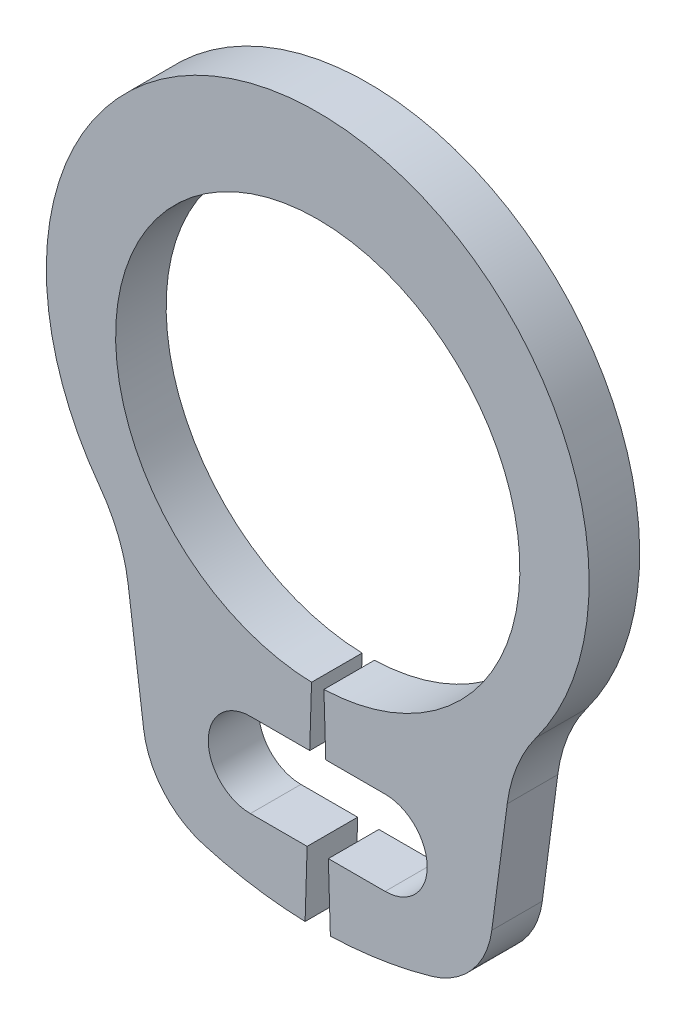
ISO-10303-21;
HEADER;
FILE_DESCRIPTION(('STEP AP214'),'2;1');
FILE_NAME('part.step','',(''),(''),'','','');
FILE_SCHEMA(('AUTOMOTIVE_DESIGN { 1 0 10303 214 1 1 1 1 }'));
ENDSEC;
DATA;
#1=APPLICATION_CONTEXT('core data for automotive mechanical design processes');
#2=APPLICATION_PROTOCOL_DEFINITION('international standard','automotive_design',2000,#1);
#3=PRODUCT_CONTEXT('',#1,'mechanical');
#4=PRODUCT('Part','Part','',(#3));
#5=PRODUCT_RELATED_PRODUCT_CATEGORY('part','',(#4));
#6=PRODUCT_DEFINITION_FORMATION('','',#4);
#7=PRODUCT_DEFINITION_CONTEXT('part definition',#1,'design');
#8=PRODUCT_DEFINITION('design','',#6,#7);
#9=PRODUCT_DEFINITION_SHAPE('','',#8);
#10=(LENGTH_UNIT() NAMED_UNIT(*) SI_UNIT(.MILLI.,.METRE.));
#11=(NAMED_UNIT(*) PLANE_ANGLE_UNIT() SI_UNIT($,.RADIAN.));
#12=(NAMED_UNIT(*) SI_UNIT($,.STERADIAN.) SOLID_ANGLE_UNIT());
#13=UNCERTAINTY_MEASURE_WITH_UNIT(LENGTH_MEASURE(1.E-05),#10,'distance_accuracy_value','');
#14=(GEOMETRIC_REPRESENTATION_CONTEXT(3) GLOBAL_UNCERTAINTY_ASSIGNED_CONTEXT((#13)) GLOBAL_UNIT_ASSIGNED_CONTEXT((#10,
#11,#12)) REPRESENTATION_CONTEXT('',''));
#15=CARTESIAN_POINT('',(0.,0.,0.));
#16=DIRECTION('',(0.,0.,1.));
#17=DIRECTION('',(1.,0.,0.));
#18=AXIS2_PLACEMENT_3D('',#15,#16,#17);
#19=CARTESIAN_POINT('',(-0.073469387755102,-2.39887520497897,-0.6));
#20=DIRECTION('',(0.999531335407904,-0.0306122448979592,0.));
#21=DIRECTION('',(0.0306122448979592,0.999531335407904,0.));
#22=AXIS2_PLACEMENT_3D('',#19,#20,#21);
#23=PLANE('',#22);
#24=DIRECTION('',(0.,0.,1.));
#25=VECTOR('',#24,1.);
#26=CARTESIAN_POINT('',(-0.0953246254901207,-3.11247837363769,-0.6));
#27=LINE('',#26,#25);
#28=CARTESIAN_POINT('',(-0.0953246254901207,-3.11247837363769,-0.6));
#29=VERTEX_POINT('',#28);
#30=CARTESIAN_POINT('',(-0.0953246254901207,-3.11247837363769,0.));
#31=VERTEX_POINT('',#30);
#32=EDGE_CURVE('E203',#29,#31,#27,.T.);
#33=ORIENTED_EDGE('',*,*,#32,.F.);
#34=DIRECTION('',(0.0306122448979592,0.999531335407904,0.));
#35=VECTOR('',#34,1.);
#36=CARTESIAN_POINT('',(-0.073469387755102,-2.39887520497897,-0.6));
#37=LINE('',#36,#35);
#38=CARTESIAN_POINT('',(-0.073469387755102,-2.39887520497897,-0.6));
#39=VERTEX_POINT('',#38);
#40=EDGE_CURVE('E192',#29,#39,#37,.T.);
#41=ORIENTED_EDGE('',*,*,#40,.T.);
#42=DIRECTION('',(0.,0.,1.));
#43=VECTOR('',#42,1.);
#44=CARTESIAN_POINT('',(-0.073469387755102,-2.39887520497897,-0.6));
#45=LINE('',#44,#43);
#46=CARTESIAN_POINT('',(-0.073469387755102,-2.39887520497897,0.));
#47=VERTEX_POINT('',#46);
#48=EDGE_CURVE('E11',#39,#47,#45,.T.);
#49=ORIENTED_EDGE('',*,*,#48,.T.);
#50=DIRECTION('',(0.0306122448979592,0.999531335407904,0.));
#51=VECTOR('',#50,1.);
#52=CARTESIAN_POINT('',(-0.073469387755102,-2.39887520497897,0.));
#53=LINE('',#52,#51);
#54=EDGE_CURVE('E281',#31,#47,#53,.T.);
#55=ORIENTED_EDGE('',*,*,#54,.F.);
#56=EDGE_LOOP('',(#33,#41,#49,#55));
#57=FACE_BOUND('',#56,.T.);
#58=ADVANCED_FACE('F32',(#57),#23,.T.);
#59=CARTESIAN_POINT('',(0.073469387755102,-2.39887520497897,-0.6));
#60=DIRECTION('',(-0.999531335407904,-0.0306122448979592,0.));
#61=DIRECTION('',(0.0306122448979592,-0.999531335407904,0.));
#62=AXIS2_PLACEMENT_3D('',#59,#60,#61);
#63=PLANE('',#62);
#64=DIRECTION('',(0.,0.,-1.));
#65=VECTOR('',#64,1.);
#66=CARTESIAN_POINT('',(0.0953246254901207,-3.11247837363769,-0.6));
#67=LINE('',#66,#65);
#68=CARTESIAN_POINT('',(0.0953246254901207,-3.11247837363769,0.));
#69=VERTEX_POINT('',#68);
#70=CARTESIAN_POINT('',(0.0953246254901207,-3.11247837363769,-0.6));
#71=VERTEX_POINT('',#70);
#72=EDGE_CURVE('E314',#69,#71,#67,.T.);
#73=ORIENTED_EDGE('',*,*,#72,.F.);
#74=DIRECTION('',(0.0306122448979592,-0.999531335407904,0.));
#75=VECTOR('',#74,1.);
#76=CARTESIAN_POINT('',(0.073469387755102,-2.39887520497897,0.));
#77=LINE('',#76,#75);
#78=CARTESIAN_POINT('',(0.073469387755102,-2.39887520497897,0.));
#79=VERTEX_POINT('',#78);
#80=EDGE_CURVE('E251',#79,#69,#77,.T.);
#81=ORIENTED_EDGE('',*,*,#80,.F.);
#82=DIRECTION('',(0.,0.,1.));
#83=VECTOR('',#82,1.);
#84=CARTESIAN_POINT('',(0.073469387755102,-2.39887520497897,-0.6));
#85=LINE('',#84,#83);
#86=CARTESIAN_POINT('',(0.073469387755102,-2.39887520497897,-0.6));
#87=VERTEX_POINT('',#86);
#88=EDGE_CURVE('E36',#87,#79,#85,.T.);
#89=ORIENTED_EDGE('',*,*,#88,.F.);
#90=DIRECTION('',(0.0306122448979592,-0.999531335407904,0.));
#91=VECTOR('',#90,1.);
#92=CARTESIAN_POINT('',(0.073469387755102,-2.39887520497897,-0.6));
#93=LINE('',#92,#91);
#94=EDGE_CURVE('E215',#87,#71,#93,.T.);
#95=ORIENTED_EDGE('',*,*,#94,.T.);
#96=EDGE_LOOP('',(#73,#81,#89,#95));
#97=FACE_BOUND('',#96,.T.);
#98=ADVANCED_FACE('F313',(#97),#63,.T.);
#99=CARTESIAN_POINT('',(0.,0.,-0.6));
#100=DIRECTION('',(0.,0.,1.));
#101=DIRECTION('',(1.,0.,0.));
#102=AXIS2_PLACEMENT_3D('',#99,#100,#101);
#103=CYLINDRICAL_SURFACE('',#102,2.4);
#104=CARTESIAN_POINT('',(0.,0.,0.));
#105=DIRECTION('',(0.,0.,-1.));
#106=DIRECTION('',(1.,0.,0.));
#107=AXIS2_PLACEMENT_3D('',#104,#105,#106);
#108=CIRCLE('',#107,2.4);
#109=EDGE_CURVE('E208',#47,#79,#108,.T.);
#110=ORIENTED_EDGE('',*,*,#109,.F.);
#111=ORIENTED_EDGE('',*,*,#48,.F.);
#112=CARTESIAN_POINT('',(0.,0.,-0.6));
#113=DIRECTION('',(0.,0.,-1.));
#114=DIRECTION('',(1.,0.,0.));
#115=AXIS2_PLACEMENT_3D('',#112,#113,#114);
#116=CIRCLE('',#115,2.4);
#117=EDGE_CURVE('E210',#39,#87,#116,.T.);
#118=ORIENTED_EDGE('',*,*,#117,.T.);
#119=ORIENTED_EDGE('',*,*,#88,.T.);
#120=EDGE_LOOP('',(#110,#111,#118,#119));
#121=FACE_BOUND('',#120,.T.);
#122=ADVANCED_FACE('F34',(#121),#103,.F.);
#123=DIRECTION('',(0.,0.,-1.));
#124=VECTOR('',#123,1.);
#125=CARTESIAN_POINT('',(-0.125951223990373,-4.11247837363769,-0.6));
#126=LINE('',#125,#124);
#127=CARTESIAN_POINT('',(-0.125951223990373,-4.11247837363769,0.));
#128=VERTEX_POINT('',#127);
#129=CARTESIAN_POINT('',(-0.125951223990373,-4.11247837363769,-0.6));
#130=VERTEX_POINT('',#129);
#131=EDGE_CURVE('E335',#128,#130,#126,.T.);
#132=ORIENTED_EDGE('',*,*,#131,.F.);
#133=CARTESIAN_POINT('',(-0.15,-4.89770354349873,0.));
#134=VERTEX_POINT('',#133);
#135=EDGE_CURVE('E214',#134,#128,#53,.T.);
#136=ORIENTED_EDGE('',*,*,#135,.F.);
#137=DIRECTION('',(0.,0.,1.));
#138=VECTOR('',#137,1.);
#139=CARTESIAN_POINT('',(-0.15,-4.89770354349873,-0.6));
#140=LINE('',#139,#138);
#141=CARTESIAN_POINT('',(-0.15,-4.89770354349873,-0.6));
#142=VERTEX_POINT('',#141);
#143=EDGE_CURVE('E41',#142,#134,#140,.T.);
#144=ORIENTED_EDGE('',*,*,#143,.F.);
#145=EDGE_CURVE('E245',#142,#130,#37,.T.);
#146=ORIENTED_EDGE('',*,*,#145,.T.);
#147=EDGE_LOOP('',(#132,#136,#144,#146));
#148=FACE_BOUND('',#147,.T.);
#149=ADVANCED_FACE('F383',(#148),#23,.T.);
#150=CARTESIAN_POINT('',(0.,0.,-0.6));
#151=DIRECTION('',(0.,0.,1.));
#152=DIRECTION('',(1.,0.,0.));
#153=AXIS2_PLACEMENT_3D('',#150,#151,#152);
#154=CYLINDRICAL_SURFACE('',#153,4.9);
#155=CARTESIAN_POINT('',(0.,0.,0.));
#156=DIRECTION('',(0.,0.,1.));
#157=DIRECTION('',(1.,0.,0.));
#158=AXIS2_PLACEMENT_3D('',#155,#156,#157);
#159=CIRCLE('',#158,4.9);
#160=CARTESIAN_POINT('',(-1.35104637666583,-4.71006090067826,0.));
#161=VERTEX_POINT('',#160);
#162=EDGE_CURVE('E278',#161,#134,#159,.T.);
#163=ORIENTED_EDGE('',*,*,#162,.F.);
#164=DIRECTION('',(0.,0.,1.));
#165=VECTOR('',#164,1.);
#166=CARTESIAN_POINT('',(-1.35104637666583,-4.71006090067826,-0.6));
#167=LINE('',#166,#165);
#168=CARTESIAN_POINT('',(-1.35104637666583,-4.71006090067826,-0.6));
#169=VERTEX_POINT('',#168);
#170=EDGE_CURVE('E285',#169,#161,#167,.T.);
#171=ORIENTED_EDGE('',*,*,#170,.F.);
#172=CARTESIAN_POINT('',(0.,0.,-0.6));
#173=DIRECTION('',(0.,0.,1.));
#174=DIRECTION('',(1.,0.,0.));
#175=AXIS2_PLACEMENT_3D('',#172,#173,#174);
#176=CIRCLE('',#175,4.9);
#177=EDGE_CURVE('E242',#169,#142,#176,.T.);
#178=ORIENTED_EDGE('',*,*,#177,.T.);
#179=ORIENTED_EDGE('',*,*,#143,.T.);
#180=EDGE_LOOP('',(#163,#171,#178,#179));
#181=FACE_BOUND('',#180,.T.);
#182=ADVANCED_FACE('F379',(#181),#154,.T.);
#183=CARTESIAN_POINT('',(-1.07532262632587,-3.7488239821725,-0.6));
#184=DIRECTION('',(0.,0.,1.));
#185=DIRECTION('',(1.,0.,0.));
#186=AXIS2_PLACEMENT_3D('',#183,#184,#185);
#187=CYLINDRICAL_SURFACE('',#186,1.);
#188=CARTESIAN_POINT('',(-1.07532262632587,-3.7488239821725,0.));
#189=DIRECTION('',(0.,0.,1.));
#190=DIRECTION('',(1.,0.,0.));
#191=AXIS2_PLACEMENT_3D('',#188,#189,#190);
#192=CIRCLE('',#191,1.);
#193=CARTESIAN_POINT('',(-2.06676748769968,-3.87935017439255,0.));
#194=VERTEX_POINT('',#193);
#195=EDGE_CURVE('E275',#194,#161,#192,.T.);
#196=ORIENTED_EDGE('',*,*,#195,.F.);
#197=DIRECTION('',(0.,0.,1.));
#198=VECTOR('',#197,1.);
#199=CARTESIAN_POINT('',(-2.06676748769968,-3.87935017439255,-0.6));
#200=LINE('',#199,#198);
#201=CARTESIAN_POINT('',(-2.06676748769968,-3.87935017439255,-0.6));
#202=VERTEX_POINT('',#201);
#203=EDGE_CURVE('E287',#202,#194,#200,.T.);
#204=ORIENTED_EDGE('',*,*,#203,.F.);
#205=CARTESIAN_POINT('',(-1.07532262632587,-3.7488239821725,-0.6));
#206=DIRECTION('',(0.,0.,1.));
#207=DIRECTION('',(1.,0.,0.));
#208=AXIS2_PLACEMENT_3D('',#205,#206,#207);
#209=CIRCLE('',#208,1.);
#210=EDGE_CURVE('E239',#202,#169,#209,.T.);
#211=ORIENTED_EDGE('',*,*,#210,.T.);
#212=ORIENTED_EDGE('',*,*,#170,.T.);
#213=EDGE_LOOP('',(#196,#204,#211,#212));
#214=FACE_BOUND('',#213,.T.);
#215=ADVANCED_FACE('F375',(#214),#187,.T.);
#216=CARTESIAN_POINT('',(-2.25011182471052,-2.48671167249759,-0.6));
#217=DIRECTION('',(-0.99144486137381,-0.130526192220052,0.));
#218=DIRECTION('',(0.130526192220052,-0.99144486137381,0.));
#219=AXIS2_PLACEMENT_3D('',#216,#217,#218);
#220=PLANE('',#219);
#221=DIRECTION('',(0.130526192220052,-0.99144486137381,0.));
#222=VECTOR('',#221,1.);
#223=CARTESIAN_POINT('',(-2.25011182471052,-2.48671167249759,0.));
#224=LINE('',#223,#222);
#225=CARTESIAN_POINT('',(-2.25011182471052,-2.48671167249759,0.));
#226=VERTEX_POINT('',#225);
#227=EDGE_CURVE('E272',#226,#194,#224,.T.);
#228=ORIENTED_EDGE('',*,*,#227,.F.);
#229=DIRECTION('',(0.,0.,1.));
#230=VECTOR('',#229,1.);
#231=CARTESIAN_POINT('',(-2.25011182471052,-2.48671167249759,-0.6));
#232=LINE('',#231,#230);
#233=CARTESIAN_POINT('',(-2.25011182471052,-2.48671167249759,-0.6));
#234=VERTEX_POINT('',#233);
#235=EDGE_CURVE('E289',#234,#226,#232,.T.);
#236=ORIENTED_EDGE('',*,*,#235,.F.);
#237=DIRECTION('',(0.130526192220052,-0.99144486137381,0.));
#238=VECTOR('',#237,1.);
#239=CARTESIAN_POINT('',(-2.25011182471052,-2.48671167249759,-0.6));
#240=LINE('',#239,#238);
#241=EDGE_CURVE('E236',#234,#202,#240,.T.);
#242=ORIENTED_EDGE('',*,*,#241,.T.);
#243=ORIENTED_EDGE('',*,*,#203,.T.);
#244=EDGE_LOOP('',(#228,#236,#242,#243));
#245=FACE_BOUND('',#244,.T.);
#246=ADVANCED_FACE('F370',(#245),#220,.T.);
#247=CARTESIAN_POINT('',(-4.07139557722225,-2.72648822733111,-0.6));
#248=DIRECTION('',(0.,0.,1.));
#249=DIRECTION('',(1.,0.,0.));
#250=AXIS2_PLACEMENT_3D('',#247,#248,#249);
#251=CYLINDRICAL_SURFACE('',#250,1.83699953821743);
#252=CARTESIAN_POINT('',(-4.07139557722225,-2.72648822733111,0.));
#253=DIRECTION('',(0.,0.,-1.));
#254=DIRECTION('',(1.,0.,0.));
#255=AXIS2_PLACEMENT_3D('',#252,#253,#254);
#256=CIRCLE('',#255,1.83699953821743);
#257=CARTESIAN_POINT('',(-2.59318641537899,-1.63586227071093,0.));
#258=VERTEX_POINT('',#257);
#259=EDGE_CURVE('E269',#258,#226,#256,.T.);
#260=ORIENTED_EDGE('',*,*,#259,.F.);
#261=DIRECTION('',(0.,0.,1.));
#262=VECTOR('',#261,1.);
#263=CARTESIAN_POINT('',(-2.59318641537899,-1.63586227071093,-0.6));
#264=LINE('',#263,#262);
#265=CARTESIAN_POINT('',(-2.59318641537899,-1.63586227071093,-0.6));
#266=VERTEX_POINT('',#265);
#267=EDGE_CURVE('E291',#266,#258,#264,.T.);
#268=ORIENTED_EDGE('',*,*,#267,.F.);
#269=CARTESIAN_POINT('',(-4.07139557722225,-2.72648822733111,-0.6));
#270=DIRECTION('',(0.,0.,-1.));
#271=DIRECTION('',(1.,0.,0.));
#272=AXIS2_PLACEMENT_3D('',#269,#270,#271);
#273=CIRCLE('',#272,1.83699953821743);
#274=EDGE_CURVE('E233',#266,#234,#273,.T.);
#275=ORIENTED_EDGE('',*,*,#274,.T.);
#276=ORIENTED_EDGE('',*,*,#235,.T.);
#277=EDGE_LOOP('',(#260,#268,#275,#276));
#278=FACE_BOUND('',#277,.T.);
#279=ADVANCED_FACE('F366',(#278),#251,.F.);
#280=CARTESIAN_POINT('',(0.,0.277396345167561,-0.6));
#281=DIRECTION('',(0.,0.,1.));
#282=DIRECTION('',(1.,0.,0.));
#283=AXIS2_PLACEMENT_3D('',#280,#281,#282);
#284=CYLINDRICAL_SURFACE('',#283,3.22260365483244);
#285=CARTESIAN_POINT('',(0.,0.277396345167561,0.));
#286=DIRECTION('',(0.,0.,1.));
#287=DIRECTION('',(1.,0.,0.));
#288=AXIS2_PLACEMENT_3D('',#285,#286,#287);
#289=CIRCLE('',#288,3.22260365483244);
#290=CARTESIAN_POINT('',(2.59318641537899,-1.63586227071093,0.));
#291=VERTEX_POINT('',#290);
#292=EDGE_CURVE('E266',#291,#258,#289,.T.);
#293=ORIENTED_EDGE('',*,*,#292,.F.);
#294=DIRECTION('',(0.,0.,1.));
#295=VECTOR('',#294,1.);
#296=CARTESIAN_POINT('',(2.59318641537899,-1.63586227071093,-0.6));
#297=LINE('',#296,#295);
#298=CARTESIAN_POINT('',(2.59318641537899,-1.63586227071093,-0.6));
#299=VERTEX_POINT('',#298);
#300=EDGE_CURVE('E293',#299,#291,#297,.T.);
#301=ORIENTED_EDGE('',*,*,#300,.F.);
#302=CARTESIAN_POINT('',(0.,0.277396345167561,-0.6));
#303=DIRECTION('',(0.,0.,1.));
#304=DIRECTION('',(1.,0.,0.));
#305=AXIS2_PLACEMENT_3D('',#302,#303,#304);
#306=CIRCLE('',#305,3.22260365483244);
#307=EDGE_CURVE('E230',#299,#266,#306,.T.);
#308=ORIENTED_EDGE('',*,*,#307,.T.);
#309=ORIENTED_EDGE('',*,*,#267,.T.);
#310=EDGE_LOOP('',(#293,#301,#308,#309));
#311=FACE_BOUND('',#310,.T.);
#312=ADVANCED_FACE('F362',(#311),#284,.T.);
#313=CARTESIAN_POINT('',(4.07139557722225,-2.72648822733111,-0.6));
#314=DIRECTION('',(0.,0.,1.));
#315=DIRECTION('',(1.,0.,0.));
#316=AXIS2_PLACEMENT_3D('',#313,#314,#315);
#317=CYLINDRICAL_SURFACE('',#316,1.83699953821743);
#318=CARTESIAN_POINT('',(4.07139557722225,-2.72648822733111,0.));
#319=DIRECTION('',(0.,0.,-1.));
#320=DIRECTION('',(1.,0.,0.));
#321=AXIS2_PLACEMENT_3D('',#318,#319,#320);
#322=CIRCLE('',#321,1.83699953821743);
#323=CARTESIAN_POINT('',(2.25011182471052,-2.48671167249759,0.));
#324=VERTEX_POINT('',#323);
#325=EDGE_CURVE('E263',#324,#291,#322,.T.);
#326=ORIENTED_EDGE('',*,*,#325,.F.);
#327=DIRECTION('',(0.,0.,1.));
#328=VECTOR('',#327,1.);
#329=CARTESIAN_POINT('',(2.25011182471052,-2.48671167249759,-0.6));
#330=LINE('',#329,#328);
#331=CARTESIAN_POINT('',(2.25011182471052,-2.48671167249759,-0.6));
#332=VERTEX_POINT('',#331);
#333=EDGE_CURVE('E295',#332,#324,#330,.T.);
#334=ORIENTED_EDGE('',*,*,#333,.F.);
#335=CARTESIAN_POINT('',(4.07139557722225,-2.72648822733111,-0.6));
#336=DIRECTION('',(0.,0.,-1.));
#337=DIRECTION('',(1.,0.,0.));
#338=AXIS2_PLACEMENT_3D('',#335,#336,#337);
#339=CIRCLE('',#338,1.83699953821743);
#340=EDGE_CURVE('E227',#332,#299,#339,.T.);
#341=ORIENTED_EDGE('',*,*,#340,.T.);
#342=ORIENTED_EDGE('',*,*,#300,.T.);
#343=EDGE_LOOP('',(#326,#334,#341,#342));
#344=FACE_BOUND('',#343,.T.);
#345=ADVANCED_FACE('F358',(#344),#317,.F.);
#346=CARTESIAN_POINT('',(2.25011182471052,-2.48671167249759,-0.6));
#347=DIRECTION('',(0.99144486137381,-0.130526192220052,0.));
#348=DIRECTION('',(0.130526192220052,0.99144486137381,0.));
#349=AXIS2_PLACEMENT_3D('',#346,#347,#348);
#350=PLANE('',#349);
#351=DIRECTION('',(0.130526192220052,0.99144486137381,0.));
#352=VECTOR('',#351,1.);
#353=CARTESIAN_POINT('',(2.25011182471052,-2.48671167249759,0.));
#354=LINE('',#353,#352);
#355=CARTESIAN_POINT('',(2.06676748769968,-3.87935017439255,0.));
#356=VERTEX_POINT('',#355);
#357=EDGE_CURVE('E260',#356,#324,#354,.T.);
#358=ORIENTED_EDGE('',*,*,#357,.F.);
#359=DIRECTION('',(0.,0.,1.));
#360=VECTOR('',#359,1.);
#361=CARTESIAN_POINT('',(2.06676748769968,-3.87935017439255,-0.6));
#362=LINE('',#361,#360);
#363=CARTESIAN_POINT('',(2.06676748769968,-3.87935017439255,-0.6));
#364=VERTEX_POINT('',#363);
#365=EDGE_CURVE('E297',#364,#356,#362,.T.);
#366=ORIENTED_EDGE('',*,*,#365,.F.);
#367=DIRECTION('',(0.130526192220052,0.99144486137381,0.));
#368=VECTOR('',#367,1.);
#369=CARTESIAN_POINT('',(2.25011182471052,-2.48671167249759,-0.6));
#370=LINE('',#369,#368);
#371=EDGE_CURVE('E224',#364,#332,#370,.T.);
#372=ORIENTED_EDGE('',*,*,#371,.T.);
#373=ORIENTED_EDGE('',*,*,#333,.T.);
#374=EDGE_LOOP('',(#358,#366,#372,#373));
#375=FACE_BOUND('',#374,.T.);
#376=ADVANCED_FACE('F354',(#375),#350,.T.);
#377=CARTESIAN_POINT('',(1.07532262632587,-3.7488239821725,-0.6));
#378=DIRECTION('',(0.,0.,1.));
#379=DIRECTION('',(1.,0.,0.));
#380=AXIS2_PLACEMENT_3D('',#377,#378,#379);
#381=CYLINDRICAL_SURFACE('',#380,1.);
#382=CARTESIAN_POINT('',(1.07532262632587,-3.7488239821725,0.));
#383=DIRECTION('',(0.,0.,1.));
#384=DIRECTION('',(-1.,0.,0.));
#385=AXIS2_PLACEMENT_3D('',#382,#383,#384);
#386=CIRCLE('',#385,1.);
#387=CARTESIAN_POINT('',(1.35104637666583,-4.71006090067826,0.));
#388=VERTEX_POINT('',#387);
#389=EDGE_CURVE('E257',#388,#356,#386,.T.);
#390=ORIENTED_EDGE('',*,*,#389,.F.);
#391=DIRECTION('',(0.,0.,1.));
#392=VECTOR('',#391,1.);
#393=CARTESIAN_POINT('',(1.35104637666583,-4.71006090067826,-0.6));
#394=LINE('',#393,#392);
#395=CARTESIAN_POINT('',(1.35104637666583,-4.71006090067826,-0.6));
#396=VERTEX_POINT('',#395);
#397=EDGE_CURVE('E299',#396,#388,#394,.T.);
#398=ORIENTED_EDGE('',*,*,#397,.F.);
#399=CARTESIAN_POINT('',(1.07532262632587,-3.7488239821725,-0.6));
#400=DIRECTION('',(0.,0.,1.));
#401=DIRECTION('',(-1.,0.,0.));
#402=AXIS2_PLACEMENT_3D('',#399,#400,#401);
#403=CIRCLE('',#402,1.);
#404=EDGE_CURVE('E221',#396,#364,#403,.T.);
#405=ORIENTED_EDGE('',*,*,#404,.T.);
#406=ORIENTED_EDGE('',*,*,#365,.T.);
#407=EDGE_LOOP('',(#390,#398,#405,#406));
#408=FACE_BOUND('',#407,.T.);
#409=ADVANCED_FACE('F351',(#408),#381,.T.);
#410=CARTESIAN_POINT('',(0.,0.,-0.6));
#411=DIRECTION('',(0.,0.,1.));
#412=DIRECTION('',(1.,0.,0.));
#413=AXIS2_PLACEMENT_3D('',#410,#411,#412);
#414=CYLINDRICAL_SURFACE('',#413,4.9);
#415=CARTESIAN_POINT('',(0.,0.,0.));
#416=DIRECTION('',(0.,0.,1.));
#417=DIRECTION('',(1.,0.,0.));
#418=AXIS2_PLACEMENT_3D('',#415,#416,#417);
#419=CIRCLE('',#418,4.9);
#420=CARTESIAN_POINT('',(0.149999999999999,-4.89770354349873,0.));
#421=VERTEX_POINT('',#420);
#422=EDGE_CURVE('E254',#421,#388,#419,.T.);
#423=ORIENTED_EDGE('',*,*,#422,.F.);
#424=DIRECTION('',(0.,0.,1.));
#425=VECTOR('',#424,1.);
#426=CARTESIAN_POINT('',(0.149999999999999,-4.89770354349873,-0.6));
#427=LINE('',#426,#425);
#428=CARTESIAN_POINT('',(0.149999999999999,-4.89770354349873,-0.6));
#429=VERTEX_POINT('',#428);
#430=EDGE_CURVE('E300',#429,#421,#427,.T.);
#431=ORIENTED_EDGE('',*,*,#430,.F.);
#432=CARTESIAN_POINT('',(0.,0.,-0.6));
#433=DIRECTION('',(0.,0.,1.));
#434=DIRECTION('',(1.,0.,0.));
#435=AXIS2_PLACEMENT_3D('',#432,#433,#434);
#436=CIRCLE('',#435,4.9);
#437=EDGE_CURVE('E218',#429,#396,#436,.T.);
#438=ORIENTED_EDGE('',*,*,#437,.T.);
#439=ORIENTED_EDGE('',*,*,#397,.T.);
#440=EDGE_LOOP('',(#423,#431,#438,#439));
#441=FACE_BOUND('',#440,.T.);
#442=ADVANCED_FACE('F347',(#441),#414,.T.);
#443=DIRECTION('',(0.,0.,1.));
#444=VECTOR('',#443,1.);
#445=CARTESIAN_POINT('',(0.125951223990373,-4.11247837363769,-0.6));
#446=LINE('',#445,#444);
#447=CARTESIAN_POINT('',(0.125951223990373,-4.11247837363769,-0.6));
#448=VERTEX_POINT('',#447);
#449=CARTESIAN_POINT('',(0.125951223990373,-4.11247837363769,0.));
#450=VERTEX_POINT('',#449);
#451=EDGE_CURVE('E330',#448,#450,#446,.T.);
#452=ORIENTED_EDGE('',*,*,#451,.F.);
#453=EDGE_CURVE('E213',#448,#429,#93,.T.);
#454=ORIENTED_EDGE('',*,*,#453,.T.);
#455=ORIENTED_EDGE('',*,*,#430,.T.);
#456=EDGE_CURVE('E250',#450,#421,#77,.T.);
#457=ORIENTED_EDGE('',*,*,#456,.F.);
#458=EDGE_LOOP('',(#452,#454,#455,#457));
#459=FACE_BOUND('',#458,.T.);
#460=ADVANCED_FACE('F345',(#459),#63,.T.);
#461=CARTESIAN_POINT('',(0.,0.,-0.6));
#462=DIRECTION('',(0.,0.,1.));
#463=DIRECTION('',(1.,0.,0.));
#464=AXIS2_PLACEMENT_3D('',#461,#462,#463);
#465=PLANE('',#464);
#466=CARTESIAN_POINT('',(0.8,-3.61247837363769,-0.6));
#467=DIRECTION('',(0.,0.,1.));
#468=DIRECTION('',(1.,0.,0.));
#469=AXIS2_PLACEMENT_3D('',#466,#467,#468);
#470=CIRCLE('',#469,0.5);
#471=CARTESIAN_POINT('',(0.8,-4.11247837363769,-0.6));
#472=VERTEX_POINT('',#471);
#473=CARTESIAN_POINT('',(0.8,-3.11247837363769,-0.6));
#474=VERTEX_POINT('',#473);
#475=EDGE_CURVE('E201',#472,#474,#470,.T.);
#476=ORIENTED_EDGE('',*,*,#475,.T.);
#477=DIRECTION('',(-1.,0.,0.));
#478=VECTOR('',#477,1.);
#479=CARTESIAN_POINT('',(-0.8,-3.11247837363769,-0.6));
#480=LINE('',#479,#478);
#481=EDGE_CURVE('E57',#474,#71,#480,.T.);
#482=ORIENTED_EDGE('',*,*,#481,.T.);
#483=ORIENTED_EDGE('',*,*,#94,.F.);
#484=ORIENTED_EDGE('',*,*,#117,.F.);
#485=ORIENTED_EDGE('',*,*,#40,.F.);
#486=CARTESIAN_POINT('',(-0.8,-3.11247837363769,-0.6));
#487=VERTEX_POINT('',#486);
#488=EDGE_CURVE('E173',#29,#487,#480,.T.);
#489=ORIENTED_EDGE('',*,*,#488,.T.);
#490=CARTESIAN_POINT('',(-0.8,-3.61247837363769,-0.6));
#491=DIRECTION('',(0.,0.,1.));
#492=DIRECTION('',(1.,0.,0.));
#493=AXIS2_PLACEMENT_3D('',#490,#491,#492);
#494=CIRCLE('',#493,0.5);
#495=CARTESIAN_POINT('',(-0.8,-4.11247837363769,-0.6));
#496=VERTEX_POINT('',#495);
#497=EDGE_CURVE('E190',#487,#496,#494,.T.);
#498=ORIENTED_EDGE('',*,*,#497,.T.);
#499=DIRECTION('',(1.,0.,0.));
#500=VECTOR('',#499,1.);
#501=CARTESIAN_POINT('',(0.8,-4.11247837363769,-0.6));
#502=LINE('',#501,#500);
#503=EDGE_CURVE('E182',#496,#130,#502,.T.);
#504=ORIENTED_EDGE('',*,*,#503,.T.);
#505=ORIENTED_EDGE('',*,*,#145,.F.);
#506=ORIENTED_EDGE('',*,*,#177,.F.);
#507=ORIENTED_EDGE('',*,*,#210,.F.);
#508=ORIENTED_EDGE('',*,*,#241,.F.);
#509=ORIENTED_EDGE('',*,*,#274,.F.);
#510=ORIENTED_EDGE('',*,*,#307,.F.);
#511=ORIENTED_EDGE('',*,*,#340,.F.);
#512=ORIENTED_EDGE('',*,*,#371,.F.);
#513=ORIENTED_EDGE('',*,*,#404,.F.);
#514=ORIENTED_EDGE('',*,*,#437,.F.);
#515=ORIENTED_EDGE('',*,*,#453,.F.);
#516=EDGE_CURVE('E322',#448,#472,#502,.T.);
#517=ORIENTED_EDGE('',*,*,#516,.T.);
#518=EDGE_LOOP('',(#476,#482,#483,#484,#485,#489,#498,#504,#505,#506,#507,#508,#509,#510,#511,
#512,#513,#514,#515,#517));
#519=FACE_BOUND('',#518,.T.);
#520=ADVANCED_FACE('F188',(#519),#465,.F.);
#521=CARTESIAN_POINT('',(0.,0.,0.));
#522=DIRECTION('',(0.,0.,1.));
#523=DIRECTION('',(1.,0.,0.));
#524=AXIS2_PLACEMENT_3D('',#521,#522,#523);
#525=PLANE('',#524);
#526=DIRECTION('',(-1.,0.,0.));
#527=VECTOR('',#526,1.);
#528=CARTESIAN_POINT('',(-0.8,-3.11247837363769,0.));
#529=LINE('',#528,#527);
#530=CARTESIAN_POINT('',(0.8,-3.11247837363769,0.));
#531=VERTEX_POINT('',#530);
#532=EDGE_CURVE('E325',#531,#69,#529,.T.);
#533=ORIENTED_EDGE('',*,*,#532,.F.);
#534=CARTESIAN_POINT('',(0.8,-3.61247837363769,0.));
#535=DIRECTION('',(0.,0.,1.));
#536=DIRECTION('',(1.,0.,0.));
#537=AXIS2_PLACEMENT_3D('',#534,#535,#536);
#538=CIRCLE('',#537,0.5);
#539=CARTESIAN_POINT('',(0.8,-4.11247837363769,0.));
#540=VERTEX_POINT('',#539);
#541=EDGE_CURVE('E197',#540,#531,#538,.T.);
#542=ORIENTED_EDGE('',*,*,#541,.F.);
#543=DIRECTION('',(1.,0.,0.));
#544=VECTOR('',#543,1.);
#545=CARTESIAN_POINT('',(0.8,-4.11247837363769,0.));
#546=LINE('',#545,#544);
#547=EDGE_CURVE('E49',#450,#540,#546,.T.);
#548=ORIENTED_EDGE('',*,*,#547,.F.);
#549=ORIENTED_EDGE('',*,*,#456,.T.);
#550=ORIENTED_EDGE('',*,*,#422,.T.);
#551=ORIENTED_EDGE('',*,*,#389,.T.);
#552=ORIENTED_EDGE('',*,*,#357,.T.);
#553=ORIENTED_EDGE('',*,*,#325,.T.);
#554=ORIENTED_EDGE('',*,*,#292,.T.);
#555=ORIENTED_EDGE('',*,*,#259,.T.);
#556=ORIENTED_EDGE('',*,*,#227,.T.);
#557=ORIENTED_EDGE('',*,*,#195,.T.);
#558=ORIENTED_EDGE('',*,*,#162,.T.);
#559=ORIENTED_EDGE('',*,*,#135,.T.);
#560=CARTESIAN_POINT('',(-0.8,-4.11247837363769,0.));
#561=VERTEX_POINT('',#560);
#562=EDGE_CURVE('E193',#561,#128,#546,.T.);
#563=ORIENTED_EDGE('',*,*,#562,.F.);
#564=CARTESIAN_POINT('',(-0.8,-3.61247837363769,0.));
#565=DIRECTION('',(0.,0.,1.));
#566=DIRECTION('',(1.,0.,0.));
#567=AXIS2_PLACEMENT_3D('',#564,#565,#566);
#568=CIRCLE('',#567,0.5);
#569=CARTESIAN_POINT('',(-0.8,-3.11247837363769,0.));
#570=VERTEX_POINT('',#569);
#571=EDGE_CURVE('E198',#570,#561,#568,.T.);
#572=ORIENTED_EDGE('',*,*,#571,.F.);
#573=EDGE_CURVE('E176',#31,#570,#529,.T.);
#574=ORIENTED_EDGE('',*,*,#573,.F.);
#575=ORIENTED_EDGE('',*,*,#54,.T.);
#576=ORIENTED_EDGE('',*,*,#109,.T.);
#577=ORIENTED_EDGE('',*,*,#80,.T.);
#578=EDGE_LOOP('',(#533,#542,#548,#549,#550,#551,#552,#553,#554,#555,#556,#557,#558,#559,#563,
#572,#574,#575,#576,#577));
#579=FACE_BOUND('',#578,.T.);
#580=ADVANCED_FACE('F317',(#579),#525,.T.);
#581=CARTESIAN_POINT('',(0.8,-3.61247837363769,-0.6));
#582=DIRECTION('',(0.,0.,1.));
#583=DIRECTION('',(1.,0.,0.));
#584=AXIS2_PLACEMENT_3D('',#581,#582,#583);
#585=CYLINDRICAL_SURFACE('',#584,0.5);
#586=ORIENTED_EDGE('',*,*,#541,.T.);
#587=DIRECTION('',(0.,0.,1.));
#588=VECTOR('',#587,1.);
#589=CARTESIAN_POINT('',(0.8,-3.11247837363769,-0.6));
#590=LINE('',#589,#588);
#591=EDGE_CURVE('E328',#474,#531,#590,.T.);
#592=ORIENTED_EDGE('',*,*,#591,.F.);
#593=ORIENTED_EDGE('',*,*,#475,.F.);
#594=DIRECTION('',(0.,0.,1.));
#595=VECTOR('',#594,1.);
#596=CARTESIAN_POINT('',(0.8,-4.11247837363769,-0.6));
#597=LINE('',#596,#595);
#598=EDGE_CURVE('E331',#472,#540,#597,.T.);
#599=ORIENTED_EDGE('',*,*,#598,.T.);
#600=EDGE_LOOP('',(#586,#592,#593,#599));
#601=FACE_BOUND('',#600,.T.);
#602=ADVANCED_FACE('F339',(#601),#585,.F.);
#603=CARTESIAN_POINT('',(-0.8,-3.61247837363769,-0.6));
#604=DIRECTION('',(0.,0.,1.));
#605=DIRECTION('',(1.,0.,0.));
#606=AXIS2_PLACEMENT_3D('',#603,#604,#605);
#607=CYLINDRICAL_SURFACE('',#606,0.5);
#608=ORIENTED_EDGE('',*,*,#571,.T.);
#609=DIRECTION('',(0.,0.,1.));
#610=VECTOR('',#609,1.);
#611=CARTESIAN_POINT('',(-0.8,-4.11247837363769,-0.6));
#612=LINE('',#611,#610);
#613=EDGE_CURVE('E181',#496,#561,#612,.T.);
#614=ORIENTED_EDGE('',*,*,#613,.F.);
#615=ORIENTED_EDGE('',*,*,#497,.F.);
#616=DIRECTION('',(0.,0.,1.));
#617=VECTOR('',#616,1.);
#618=CARTESIAN_POINT('',(-0.8,-3.11247837363769,-0.6));
#619=LINE('',#618,#617);
#620=EDGE_CURVE('E170',#487,#570,#619,.T.);
#621=ORIENTED_EDGE('',*,*,#620,.T.);
#622=EDGE_LOOP('',(#608,#614,#615,#621));
#623=FACE_BOUND('',#622,.T.);
#624=ADVANCED_FACE('F196',(#623),#607,.F.);
#625=CARTESIAN_POINT('',(-0.8,-3.11247837363769,-0.6));
#626=DIRECTION('',(0.,1.,0.));
#627=DIRECTION('',(0.,0.,1.));
#628=AXIS2_PLACEMENT_3D('',#625,#626,#627);
#629=PLANE('',#628);
#630=ORIENTED_EDGE('',*,*,#32,.T.);
#631=ORIENTED_EDGE('',*,*,#573,.T.);
#632=ORIENTED_EDGE('',*,*,#620,.F.);
#633=ORIENTED_EDGE('',*,*,#488,.F.);
#634=EDGE_LOOP('',(#630,#631,#632,#633));
#635=FACE_BOUND('',#634,.T.);
#636=ADVANCED_FACE('F172',(#635),#629,.F.);
#637=CARTESIAN_POINT('',(0.8,-4.11247837363769,-0.6));
#638=DIRECTION('',(0.,-1.,0.));
#639=DIRECTION('',(1.,0.,0.));
#640=AXIS2_PLACEMENT_3D('',#637,#638,#639);
#641=PLANE('',#640);
#642=ORIENTED_EDGE('',*,*,#131,.T.);
#643=ORIENTED_EDGE('',*,*,#503,.F.);
#644=ORIENTED_EDGE('',*,*,#613,.T.);
#645=ORIENTED_EDGE('',*,*,#562,.T.);
#646=EDGE_LOOP('',(#642,#643,#644,#645));
#647=FACE_BOUND('',#646,.T.);
#648=ADVANCED_FACE('F386',(#647),#641,.F.);
#649=ORIENTED_EDGE('',*,*,#451,.T.);
#650=ORIENTED_EDGE('',*,*,#547,.T.);
#651=ORIENTED_EDGE('',*,*,#598,.F.);
#652=ORIENTED_EDGE('',*,*,#516,.F.);
#653=EDGE_LOOP('',(#649,#650,#651,#652));
#654=FACE_BOUND('',#653,.T.);
#655=ADVANCED_FACE('F340',(#654),#641,.F.);
#656=ORIENTED_EDGE('',*,*,#72,.T.);
#657=ORIENTED_EDGE('',*,*,#481,.F.);
#658=ORIENTED_EDGE('',*,*,#591,.T.);
#659=ORIENTED_EDGE('',*,*,#532,.T.);
#660=EDGE_LOOP('',(#656,#657,#658,#659));
#661=FACE_BOUND('',#660,.T.);
#662=ADVANCED_FACE('F336',(#661),#629,.F.);
#663=CLOSED_SHELL('',(#58,#98,#122,#149,#182,#215,#246,#279,#312,#345,#376,#409,#442,#460,#520,
#580,#602,#624,#636,#648,#655,#662));
#664=MANIFOLD_SOLID_BREP('B2',#663);
#665=ADVANCED_BREP_SHAPE_REPRESENTATION('',(#18,#664),#14);
#666=SHAPE_DEFINITION_REPRESENTATION(#9,#665);
ENDSEC;
END-ISO-10303-21;
